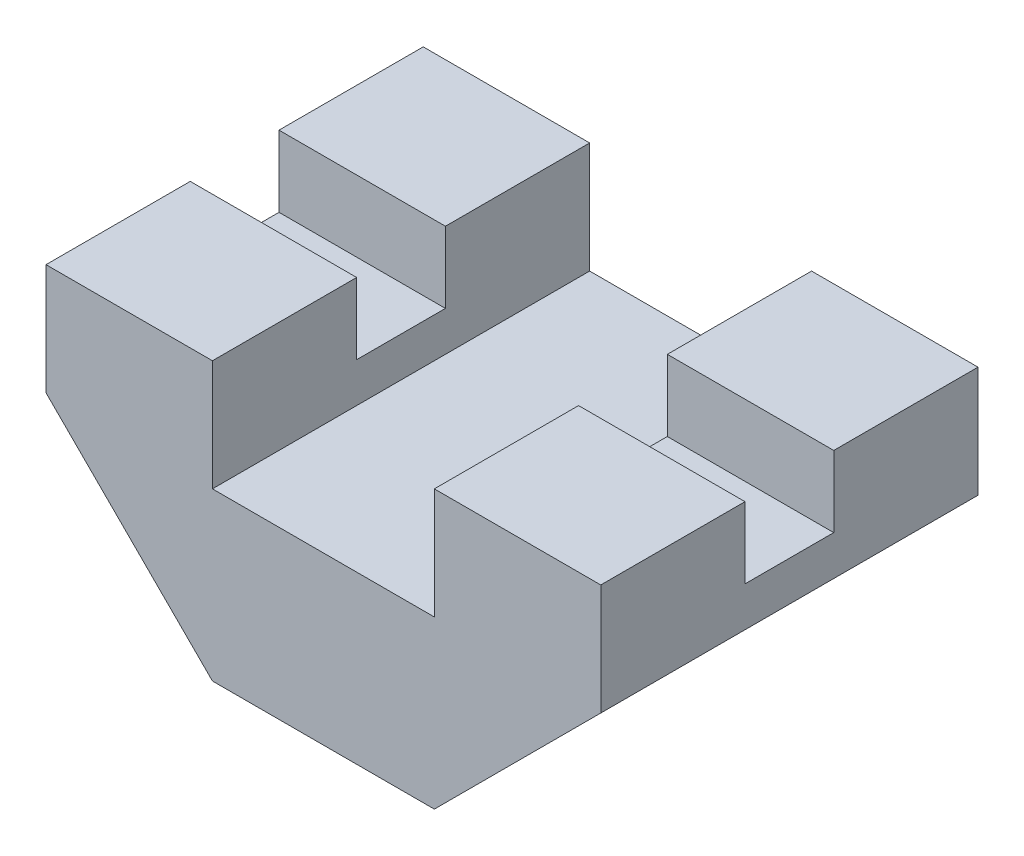
ISO-10303-21;
HEADER;
FILE_DESCRIPTION(('STEP AP214'),'2;1');
FILE_NAME('part.step','',(''),(''),'','','');
FILE_SCHEMA(('AUTOMOTIVE_DESIGN { 1 0 10303 214 1 1 1 1 }'));
ENDSEC;
DATA;
#1=APPLICATION_CONTEXT('core data for automotive mechanical design processes');
#2=APPLICATION_PROTOCOL_DEFINITION('international standard','automotive_design',2000,#1);
#3=PRODUCT_CONTEXT('',#1,'mechanical');
#4=PRODUCT('Part','Part','',(#3));
#5=PRODUCT_RELATED_PRODUCT_CATEGORY('part','',(#4));
#6=PRODUCT_DEFINITION_FORMATION('','',#4);
#7=PRODUCT_DEFINITION_CONTEXT('part definition',#1,'design');
#8=PRODUCT_DEFINITION('design','',#6,#7);
#9=PRODUCT_DEFINITION_SHAPE('','',#8);
#10=(LENGTH_UNIT() NAMED_UNIT(*) SI_UNIT(.MILLI.,.METRE.));
#11=(NAMED_UNIT(*) PLANE_ANGLE_UNIT() SI_UNIT($,.RADIAN.));
#12=(NAMED_UNIT(*) SI_UNIT($,.STERADIAN.) SOLID_ANGLE_UNIT());
#13=UNCERTAINTY_MEASURE_WITH_UNIT(LENGTH_MEASURE(1.E-05),#10,'distance_accuracy_value','');
#14=(GEOMETRIC_REPRESENTATION_CONTEXT(3) GLOBAL_UNCERTAINTY_ASSIGNED_CONTEXT((#13)) GLOBAL_UNIT_ASSIGNED_CONTEXT((#10,
#11,#12)) REPRESENTATION_CONTEXT('',''));
#15=CARTESIAN_POINT('',(0.,0.,0.));
#16=DIRECTION('',(0.,0.,1.));
#17=DIRECTION('',(1.,0.,0.));
#18=AXIS2_PLACEMENT_3D('',#15,#16,#17);
#19=CARTESIAN_POINT('',(-448.962557603687,776.680107526882,1727.2));
#20=DIRECTION('',(0.,-1.,0.));
#21=DIRECTION('',(1.,0.,0.));
#22=AXIS2_PLACEMENT_3D('',#19,#20,#21);
#23=PLANE('',#22);
#24=DIRECTION('',(0.,0.,-1.));
#25=VECTOR('',#24,1.);
#26=CARTESIAN_POINT('',(313.037442396313,776.680107526882,1727.2));
#27=LINE('',#26,#25);
#28=CARTESIAN_POINT('',(313.037442396313,776.680107526882,1727.2));
#29=VERTEX_POINT('',#28);
#30=CARTESIAN_POINT('',(313.037442396313,776.680107526882,1066.8));
#31=VERTEX_POINT('',#30);
#32=EDGE_CURVE('E326',#29,#31,#27,.T.);
#33=ORIENTED_EDGE('',*,*,#32,.T.);
#34=DIRECTION('',(1.,0.,0.));
#35=VECTOR('',#34,1.);
#36=CARTESIAN_POINT('',(-2226.96255760369,776.680107526882,1066.8));
#37=LINE('',#36,#35);
#38=CARTESIAN_POINT('',(-448.962557603687,776.680107526882,1066.8));
#39=VERTEX_POINT('',#38);
#40=EDGE_CURVE('E215',#39,#31,#37,.T.);
#41=ORIENTED_EDGE('',*,*,#40,.F.);
#42=DIRECTION('',(0.,0.,-1.));
#43=VECTOR('',#42,1.);
#44=CARTESIAN_POINT('',(-448.962557603687,776.680107526882,1727.2));
#45=LINE('',#44,#43);
#46=CARTESIAN_POINT('',(-448.962557603687,776.680107526882,1727.2));
#47=VERTEX_POINT('',#46);
#48=EDGE_CURVE('E321',#47,#39,#45,.T.);
#49=ORIENTED_EDGE('',*,*,#48,.F.);
#50=DIRECTION('',(-1.,0.,0.));
#51=VECTOR('',#50,1.);
#52=CARTESIAN_POINT('',(-448.962557603687,776.680107526882,1727.2));
#53=LINE('',#52,#51);
#54=EDGE_CURVE('E256',#29,#47,#53,.T.);
#55=ORIENTED_EDGE('',*,*,#54,.F.);
#56=EDGE_LOOP('',(#33,#41,#49,#55));
#57=FACE_BOUND('',#56,.T.);
#58=ADVANCED_FACE('F45',(#57),#23,.F.);
#59=CARTESIAN_POINT('',(-2226.96255760369,776.680107526882,1727.2));
#60=DIRECTION('',(0.,-1.,0.));
#61=DIRECTION('',(0.,0.,-1.));
#62=AXIS2_PLACEMENT_3D('',#59,#60,#61);
#63=PLANE('',#62);
#64=DIRECTION('',(0.,0.,-1.));
#65=VECTOR('',#64,1.);
#66=CARTESIAN_POINT('',(-1464.96255760369,776.680107526882,1727.2));
#67=LINE('',#66,#65);
#68=CARTESIAN_POINT('',(-1464.96255760369,776.680107526882,1727.2));
#69=VERTEX_POINT('',#68);
#70=CARTESIAN_POINT('',(-1464.96255760369,776.680107526882,1066.8));
#71=VERTEX_POINT('',#70);
#72=EDGE_CURVE('E308',#69,#71,#67,.T.);
#73=ORIENTED_EDGE('',*,*,#72,.T.);
#74=CARTESIAN_POINT('',(-2226.96255760369,776.680107526882,1066.8));
#75=VERTEX_POINT('',#74);
#76=EDGE_CURVE('E212',#75,#71,#37,.T.);
#77=ORIENTED_EDGE('',*,*,#76,.F.);
#78=DIRECTION('',(0.,0.,-1.));
#79=VECTOR('',#78,1.);
#80=CARTESIAN_POINT('',(-2226.96255760369,776.680107526882,1727.2));
#81=LINE('',#80,#79);
#82=CARTESIAN_POINT('',(-2226.96255760369,776.680107526882,1727.2));
#83=VERTEX_POINT('',#82);
#84=EDGE_CURVE('E196',#83,#75,#81,.T.);
#85=ORIENTED_EDGE('',*,*,#84,.F.);
#86=DIRECTION('',(-1.,0.,0.));
#87=VECTOR('',#86,1.);
#88=CARTESIAN_POINT('',(-2226.96255760369,776.680107526882,1727.2));
#89=LINE('',#88,#87);
#90=EDGE_CURVE('E268',#69,#83,#89,.T.);
#91=ORIENTED_EDGE('',*,*,#90,.F.);
#92=EDGE_LOOP('',(#73,#77,#85,#91));
#93=FACE_BOUND('',#92,.T.);
#94=ADVANCED_FACE('F372',(#93),#63,.F.);
#95=CARTESIAN_POINT('',(-2226.96255760369,776.680107526882,1727.2));
#96=DIRECTION('',(1.,0.,0.));
#97=DIRECTION('',(0.,0.,-1.));
#98=AXIS2_PLACEMENT_3D('',#95,#96,#97);
#99=PLANE('',#98);
#100=ORIENTED_EDGE('',*,*,#84,.T.);
#101=DIRECTION('',(0.,-1.,0.));
#102=VECTOR('',#101,1.);
#103=CARTESIAN_POINT('',(-2226.96255760369,776.680107526882,1066.8));
#104=LINE('',#103,#102);
#105=CARTESIAN_POINT('',(-2226.96255760369,450.776221941659,1066.8));
#106=VERTEX_POINT('',#105);
#107=EDGE_CURVE('E175',#75,#106,#104,.T.);
#108=ORIENTED_EDGE('',*,*,#107,.T.);
#109=DIRECTION('',(0.,0.,-1.));
#110=VECTOR('',#109,1.);
#111=CARTESIAN_POINT('',(-2226.96255760369,450.776221941659,1066.8));
#112=LINE('',#111,#110);
#113=CARTESIAN_POINT('',(-2226.96255760369,450.776221941659,660.4));
#114=VERTEX_POINT('',#113);
#115=EDGE_CURVE('E184',#106,#114,#112,.T.);
#116=ORIENTED_EDGE('',*,*,#115,.T.);
#117=DIRECTION('',(0.,1.,0.));
#118=VECTOR('',#117,1.);
#119=CARTESIAN_POINT('',(-2226.96255760369,776.680107526882,660.4));
#120=LINE('',#119,#118);
#121=CARTESIAN_POINT('',(-2226.96255760369,776.680107526882,660.4));
#122=VERTEX_POINT('',#121);
#123=EDGE_CURVE('E191',#114,#122,#120,.T.);
#124=ORIENTED_EDGE('',*,*,#123,.T.);
#125=CARTESIAN_POINT('',(-2226.96255760369,776.680107526882,0.));
#126=VERTEX_POINT('',#125);
#127=EDGE_CURVE('E271',#122,#126,#81,.T.);
#128=ORIENTED_EDGE('',*,*,#127,.T.);
#129=DIRECTION('',(0.,-1.,0.));
#130=VECTOR('',#129,1.);
#131=CARTESIAN_POINT('',(-2226.96255760369,776.680107526882,0.));
#132=LINE('',#131,#130);
#133=CARTESIAN_POINT('',(-2226.96255760369,268.680107526882,0.));
#134=VERTEX_POINT('',#133);
#135=EDGE_CURVE('E238',#126,#134,#132,.T.);
#136=ORIENTED_EDGE('',*,*,#135,.T.);
#137=DIRECTION('',(0.,0.,-1.));
#138=VECTOR('',#137,1.);
#139=CARTESIAN_POINT('',(-2226.96255760369,268.680107526882,1727.2));
#140=LINE('',#139,#138);
#141=CARTESIAN_POINT('',(-2226.96255760369,268.680107526882,1727.2));
#142=VERTEX_POINT('',#141);
#143=EDGE_CURVE('E54',#142,#134,#140,.T.);
#144=ORIENTED_EDGE('',*,*,#143,.F.);
#145=DIRECTION('',(0.,-1.,0.));
#146=VECTOR('',#145,1.);
#147=CARTESIAN_POINT('',(-2226.96255760369,776.680107526882,1727.2));
#148=LINE('',#147,#146);
#149=EDGE_CURVE('E239',#83,#142,#148,.T.);
#150=ORIENTED_EDGE('',*,*,#149,.F.);
#151=EDGE_LOOP('',(#100,#108,#116,#124,#128,#136,#144,#150));
#152=FACE_BOUND('',#151,.T.);
#153=ADVANCED_FACE('F47',(#152),#99,.F.);
#154=CARTESIAN_POINT('',(-2226.96255760369,268.680107526882,1727.2));
#155=DIRECTION('',(0.707106781186549,0.707106781186546,0.));
#156=DIRECTION('',(-0.707106781186546,0.707106781186549,0.));
#157=AXIS2_PLACEMENT_3D('',#154,#155,#156);
#158=PLANE('',#157);
#159=DIRECTION('',(0.707106781186546,-0.707106781186549,0.));
#160=VECTOR('',#159,1.);
#161=CARTESIAN_POINT('',(-2226.96255760369,268.680107526882,0.));
#162=LINE('',#161,#160);
#163=CARTESIAN_POINT('',(-1464.96255760369,-493.319892473118,0.));
#164=VERTEX_POINT('',#163);
#165=EDGE_CURVE('E275',#134,#164,#162,.T.);
#166=ORIENTED_EDGE('',*,*,#165,.T.);
#167=DIRECTION('',(0.,0.,-1.));
#168=VECTOR('',#167,1.);
#169=CARTESIAN_POINT('',(-1464.96255760369,-493.319892473118,1727.2));
#170=LINE('',#169,#168);
#171=CARTESIAN_POINT('',(-1464.96255760369,-493.319892473118,1727.2));
#172=VERTEX_POINT('',#171);
#173=EDGE_CURVE('E338',#172,#164,#170,.T.);
#174=ORIENTED_EDGE('',*,*,#173,.F.);
#175=DIRECTION('',(0.707106781186546,-0.707106781186549,0.));
#176=VECTOR('',#175,1.);
#177=CARTESIAN_POINT('',(-2226.96255760369,268.680107526882,1727.2));
#178=LINE('',#177,#176);
#179=EDGE_CURVE('E243',#142,#172,#178,.T.);
#180=ORIENTED_EDGE('',*,*,#179,.F.);
#181=ORIENTED_EDGE('',*,*,#143,.T.);
#182=EDGE_LOOP('',(#166,#174,#180,#181));
#183=FACE_BOUND('',#182,.T.);
#184=ADVANCED_FACE('F345',(#183),#158,.F.);
#185=CARTESIAN_POINT('',(-1464.96255760369,-493.319892473118,1727.2));
#186=DIRECTION('',(0.,1.,0.));
#187=DIRECTION('',(-1.,0.,0.));
#188=AXIS2_PLACEMENT_3D('',#185,#186,#187);
#189=PLANE('',#188);
#190=DIRECTION('',(1.,0.,0.));
#191=VECTOR('',#190,1.);
#192=CARTESIAN_POINT('',(-1464.96255760369,-493.319892473118,0.));
#193=LINE('',#192,#191);
#194=CARTESIAN_POINT('',(-448.962557603687,-493.319892473118,0.));
#195=VERTEX_POINT('',#194);
#196=EDGE_CURVE('E278',#164,#195,#193,.T.);
#197=ORIENTED_EDGE('',*,*,#196,.T.);
#198=DIRECTION('',(0.,0.,-1.));
#199=VECTOR('',#198,1.);
#200=CARTESIAN_POINT('',(-448.962557603687,-493.319892473118,1727.2));
#201=LINE('',#200,#199);
#202=CARTESIAN_POINT('',(-448.962557603687,-493.319892473118,1727.2));
#203=VERTEX_POINT('',#202);
#204=EDGE_CURVE('E334',#203,#195,#201,.T.);
#205=ORIENTED_EDGE('',*,*,#204,.F.);
#206=DIRECTION('',(1.,0.,0.));
#207=VECTOR('',#206,1.);
#208=CARTESIAN_POINT('',(-1464.96255760369,-493.319892473118,1727.2));
#209=LINE('',#208,#207);
#210=EDGE_CURVE('E247',#172,#203,#209,.T.);
#211=ORIENTED_EDGE('',*,*,#210,.F.);
#212=ORIENTED_EDGE('',*,*,#173,.T.);
#213=EDGE_LOOP('',(#197,#205,#211,#212));
#214=FACE_BOUND('',#213,.T.);
#215=ADVANCED_FACE('F358',(#214),#189,.F.);
#216=CARTESIAN_POINT('',(-448.962557603687,-493.319892473118,1727.2));
#217=DIRECTION('',(-0.707106781186546,0.707106781186549,0.));
#218=DIRECTION('',(-0.707106781186549,-0.707106781186546,0.));
#219=AXIS2_PLACEMENT_3D('',#216,#217,#218);
#220=PLANE('',#219);
#221=DIRECTION('',(0.707106781186549,0.707106781186546,0.));
#222=VECTOR('',#221,1.);
#223=CARTESIAN_POINT('',(-448.962557603687,-493.319892473118,0.));
#224=LINE('',#223,#222);
#225=CARTESIAN_POINT('',(313.037442396313,268.680107526879,0.));
#226=VERTEX_POINT('',#225);
#227=EDGE_CURVE('E281',#195,#226,#224,.T.);
#228=ORIENTED_EDGE('',*,*,#227,.T.);
#229=DIRECTION('',(0.,0.,-1.));
#230=VECTOR('',#229,1.);
#231=CARTESIAN_POINT('',(313.037442396313,268.680107526879,1727.2));
#232=LINE('',#231,#230);
#233=CARTESIAN_POINT('',(313.037442396313,268.680107526879,1727.2));
#234=VERTEX_POINT('',#233);
#235=EDGE_CURVE('E330',#234,#226,#232,.T.);
#236=ORIENTED_EDGE('',*,*,#235,.F.);
#237=DIRECTION('',(0.707106781186549,0.707106781186546,0.));
#238=VECTOR('',#237,1.);
#239=CARTESIAN_POINT('',(-448.962557603687,-493.319892473118,1727.2));
#240=LINE('',#239,#238);
#241=EDGE_CURVE('E250',#203,#234,#240,.T.);
#242=ORIENTED_EDGE('',*,*,#241,.F.);
#243=ORIENTED_EDGE('',*,*,#204,.T.);
#244=EDGE_LOOP('',(#228,#236,#242,#243));
#245=FACE_BOUND('',#244,.T.);
#246=ADVANCED_FACE('F362',(#245),#220,.F.);
#247=CARTESIAN_POINT('',(313.037442396313,776.680107526882,1727.2));
#248=DIRECTION('',(-1.,0.,0.));
#249=DIRECTION('',(0.,-1.,0.));
#250=AXIS2_PLACEMENT_3D('',#247,#248,#249);
#251=PLANE('',#250);
#252=DIRECTION('',(0.,0.,-1.));
#253=VECTOR('',#252,1.);
#254=CARTESIAN_POINT('',(313.037442396313,450.776221941659,1066.8));
#255=LINE('',#254,#253);
#256=CARTESIAN_POINT('',(313.037442396313,450.776221941659,1066.8));
#257=VERTEX_POINT('',#256);
#258=CARTESIAN_POINT('',(313.037442396313,450.776221941659,660.4));
#259=VERTEX_POINT('',#258);
#260=EDGE_CURVE('E201',#257,#259,#255,.T.);
#261=ORIENTED_EDGE('',*,*,#260,.F.);
#262=DIRECTION('',(0.,-1.,0.));
#263=VECTOR('',#262,1.);
#264=CARTESIAN_POINT('',(313.037442396313,776.680107526882,1066.8));
#265=LINE('',#264,#263);
#266=EDGE_CURVE('E206',#31,#257,#265,.T.);
#267=ORIENTED_EDGE('',*,*,#266,.F.);
#268=ORIENTED_EDGE('',*,*,#32,.F.);
#269=DIRECTION('',(0.,1.,0.));
#270=VECTOR('',#269,1.);
#271=CARTESIAN_POINT('',(313.037442396313,776.680107526882,1727.2));
#272=LINE('',#271,#270);
#273=EDGE_CURVE('E253',#234,#29,#272,.T.);
#274=ORIENTED_EDGE('',*,*,#273,.F.);
#275=ORIENTED_EDGE('',*,*,#235,.T.);
#276=DIRECTION('',(0.,1.,0.));
#277=VECTOR('',#276,1.);
#278=CARTESIAN_POINT('',(313.037442396313,776.680107526882,0.));
#279=LINE('',#278,#277);
#280=CARTESIAN_POINT('',(313.037442396313,776.680107526882,0.));
#281=VERTEX_POINT('',#280);
#282=EDGE_CURVE('E284',#226,#281,#279,.T.);
#283=ORIENTED_EDGE('',*,*,#282,.T.);
#284=CARTESIAN_POINT('',(313.037442396313,776.680107526882,660.4));
#285=VERTEX_POINT('',#284);
#286=EDGE_CURVE('E325',#285,#281,#27,.T.);
#287=ORIENTED_EDGE('',*,*,#286,.F.);
#288=DIRECTION('',(0.,1.,0.));
#289=VECTOR('',#288,1.);
#290=CARTESIAN_POINT('',(313.037442396313,776.680107526882,660.4));
#291=LINE('',#290,#289);
#292=EDGE_CURVE('E198',#259,#285,#291,.T.);
#293=ORIENTED_EDGE('',*,*,#292,.F.);
#294=EDGE_LOOP('',(#261,#267,#268,#274,#275,#283,#287,#293));
#295=FACE_BOUND('',#294,.T.);
#296=ADVANCED_FACE('F395',(#295),#251,.F.);
#297=CARTESIAN_POINT('',(-448.962557603687,776.680107526882,660.4));
#298=VERTEX_POINT('',#297);
#299=CARTESIAN_POINT('',(-448.962557603687,776.680107526882,0.));
#300=VERTEX_POINT('',#299);
#301=EDGE_CURVE('E320',#298,#300,#45,.T.);
#302=ORIENTED_EDGE('',*,*,#301,.F.);
#303=DIRECTION('',(1.,0.,0.));
#304=VECTOR('',#303,1.);
#305=CARTESIAN_POINT('',(-2226.96255760369,776.680107526882,660.4));
#306=LINE('',#305,#304);
#307=EDGE_CURVE('E219',#298,#285,#306,.T.);
#308=ORIENTED_EDGE('',*,*,#307,.T.);
#309=ORIENTED_EDGE('',*,*,#286,.T.);
#310=DIRECTION('',(-1.,0.,0.));
#311=VECTOR('',#310,1.);
#312=CARTESIAN_POINT('',(-448.962557603687,776.680107526882,0.));
#313=LINE('',#312,#311);
#314=EDGE_CURVE('E288',#281,#300,#313,.T.);
#315=ORIENTED_EDGE('',*,*,#314,.T.);
#316=EDGE_LOOP('',(#302,#308,#309,#315));
#317=FACE_BOUND('',#316,.T.);
#318=ADVANCED_FACE('F401',(#317),#23,.F.);
#319=CARTESIAN_POINT('',(-448.962557603687,776.680107526882,1727.2));
#320=DIRECTION('',(1.,0.,0.));
#321=DIRECTION('',(0.,1.,0.));
#322=AXIS2_PLACEMENT_3D('',#319,#320,#321);
#323=PLANE('',#322);
#324=ORIENTED_EDGE('',*,*,#48,.T.);
#325=DIRECTION('',(0.,-1.,0.));
#326=VECTOR('',#325,1.);
#327=CARTESIAN_POINT('',(-448.962557603687,776.680107526882,1066.8));
#328=LINE('',#327,#326);
#329=CARTESIAN_POINT('',(-448.962557603687,450.776221941659,1066.8));
#330=VERTEX_POINT('',#329);
#331=EDGE_CURVE('E230',#39,#330,#328,.T.);
#332=ORIENTED_EDGE('',*,*,#331,.T.);
#333=DIRECTION('',(0.,0.,-1.));
#334=VECTOR('',#333,1.);
#335=CARTESIAN_POINT('',(-448.962557603687,450.776221941659,1727.2));
#336=LINE('',#335,#334);
#337=CARTESIAN_POINT('',(-448.962557603687,450.776221941659,660.4));
#338=VERTEX_POINT('',#337);
#339=EDGE_CURVE('E234',#330,#338,#336,.T.);
#340=ORIENTED_EDGE('',*,*,#339,.T.);
#341=DIRECTION('',(0.,1.,0.));
#342=VECTOR('',#341,1.);
#343=CARTESIAN_POINT('',(-448.962557603687,776.680107526882,660.4));
#344=LINE('',#343,#342);
#345=EDGE_CURVE('E224',#338,#298,#344,.T.);
#346=ORIENTED_EDGE('',*,*,#345,.T.);
#347=ORIENTED_EDGE('',*,*,#301,.T.);
#348=DIRECTION('',(0.,-1.,0.));
#349=VECTOR('',#348,1.);
#350=CARTESIAN_POINT('',(-448.962557603687,776.680107526882,0.));
#351=LINE('',#350,#349);
#352=CARTESIAN_POINT('',(-448.962557603687,268.680107526882,0.));
#353=VERTEX_POINT('',#352);
#354=EDGE_CURVE('E292',#300,#353,#351,.T.);
#355=ORIENTED_EDGE('',*,*,#354,.T.);
#356=DIRECTION('',(0.,0.,-1.));
#357=VECTOR('',#356,1.);
#358=CARTESIAN_POINT('',(-448.962557603687,268.680107526882,1727.2));
#359=LINE('',#358,#357);
#360=CARTESIAN_POINT('',(-448.962557603687,268.680107526882,1727.2));
#361=VERTEX_POINT('',#360);
#362=EDGE_CURVE('E316',#361,#353,#359,.T.);
#363=ORIENTED_EDGE('',*,*,#362,.F.);
#364=DIRECTION('',(0.,-1.,0.));
#365=VECTOR('',#364,1.);
#366=CARTESIAN_POINT('',(-448.962557603687,776.680107526882,1727.2));
#367=LINE('',#366,#365);
#368=EDGE_CURVE('E259',#47,#361,#367,.T.);
#369=ORIENTED_EDGE('',*,*,#368,.F.);
#370=EDGE_LOOP('',(#324,#332,#340,#346,#347,#355,#363,#369));
#371=FACE_BOUND('',#370,.T.);
#372=ADVANCED_FACE('F414',(#371),#323,.F.);
#373=CARTESIAN_POINT('',(-1464.96255760369,268.680107526882,1727.2));
#374=DIRECTION('',(0.,-1.,0.));
#375=DIRECTION('',(0.,0.,-1.));
#376=AXIS2_PLACEMENT_3D('',#373,#374,#375);
#377=PLANE('',#376);
#378=DIRECTION('',(-1.,0.,0.));
#379=VECTOR('',#378,1.);
#380=CARTESIAN_POINT('',(-1464.96255760369,268.680107526882,0.));
#381=LINE('',#380,#379);
#382=CARTESIAN_POINT('',(-1464.96255760369,268.680107526882,0.));
#383=VERTEX_POINT('',#382);
#384=EDGE_CURVE('E295',#353,#383,#381,.T.);
#385=ORIENTED_EDGE('',*,*,#384,.T.);
#386=DIRECTION('',(0.,0.,-1.));
#387=VECTOR('',#386,1.);
#388=CARTESIAN_POINT('',(-1464.96255760369,268.680107526882,1727.2));
#389=LINE('',#388,#387);
#390=CARTESIAN_POINT('',(-1464.96255760369,268.680107526882,1727.2));
#391=VERTEX_POINT('',#390);
#392=EDGE_CURVE('E312',#391,#383,#389,.T.);
#393=ORIENTED_EDGE('',*,*,#392,.F.);
#394=DIRECTION('',(-1.,0.,0.));
#395=VECTOR('',#394,1.);
#396=CARTESIAN_POINT('',(-1464.96255760369,268.680107526882,1727.2));
#397=LINE('',#396,#395);
#398=EDGE_CURVE('E262',#361,#391,#397,.T.);
#399=ORIENTED_EDGE('',*,*,#398,.F.);
#400=ORIENTED_EDGE('',*,*,#362,.T.);
#401=EDGE_LOOP('',(#385,#393,#399,#400));
#402=FACE_BOUND('',#401,.T.);
#403=ADVANCED_FACE('F410',(#402),#377,.F.);
#404=CARTESIAN_POINT('',(-1464.96255760369,776.680107526882,1727.2));
#405=DIRECTION('',(-1.,0.,0.));
#406=DIRECTION('',(0.,0.,1.));
#407=AXIS2_PLACEMENT_3D('',#404,#405,#406);
#408=PLANE('',#407);
#409=DIRECTION('',(0.,0.,1.));
#410=VECTOR('',#409,1.);
#411=CARTESIAN_POINT('',(-1464.96255760369,450.776221941659,1727.2));
#412=LINE('',#411,#410);
#413=CARTESIAN_POINT('',(-1464.96255760369,450.776221941659,660.4));
#414=VERTEX_POINT('',#413);
#415=CARTESIAN_POINT('',(-1464.96255760369,450.776221941659,1066.8));
#416=VERTEX_POINT('',#415);
#417=EDGE_CURVE('E11',#414,#416,#412,.T.);
#418=ORIENTED_EDGE('',*,*,#417,.T.);
#419=DIRECTION('',(0.,1.,0.));
#420=VECTOR('',#419,1.);
#421=CARTESIAN_POINT('',(-1464.96255760369,776.680107526882,1066.8));
#422=LINE('',#421,#420);
#423=EDGE_CURVE('E178',#416,#71,#422,.T.);
#424=ORIENTED_EDGE('',*,*,#423,.T.);
#425=ORIENTED_EDGE('',*,*,#72,.F.);
#426=DIRECTION('',(0.,1.,0.));
#427=VECTOR('',#426,1.);
#428=CARTESIAN_POINT('',(-1464.96255760369,776.680107526882,1727.2));
#429=LINE('',#428,#427);
#430=EDGE_CURVE('E265',#391,#69,#429,.T.);
#431=ORIENTED_EDGE('',*,*,#430,.F.);
#432=ORIENTED_EDGE('',*,*,#392,.T.);
#433=DIRECTION('',(0.,1.,0.));
#434=VECTOR('',#433,1.);
#435=CARTESIAN_POINT('',(-1464.96255760369,776.680107526882,0.));
#436=LINE('',#435,#434);
#437=CARTESIAN_POINT('',(-1464.96255760369,776.680107526882,0.));
#438=VERTEX_POINT('',#437);
#439=EDGE_CURVE('E298',#383,#438,#436,.T.);
#440=ORIENTED_EDGE('',*,*,#439,.T.);
#441=CARTESIAN_POINT('',(-1464.96255760369,776.680107526882,660.4));
#442=VERTEX_POINT('',#441);
#443=EDGE_CURVE('E307',#442,#438,#67,.T.);
#444=ORIENTED_EDGE('',*,*,#443,.F.);
#445=DIRECTION('',(0.,-1.,0.));
#446=VECTOR('',#445,1.);
#447=CARTESIAN_POINT('',(-1464.96255760369,776.680107526882,660.4));
#448=LINE('',#447,#446);
#449=EDGE_CURVE('E69',#442,#414,#448,.T.);
#450=ORIENTED_EDGE('',*,*,#449,.T.);
#451=EDGE_LOOP('',(#418,#424,#425,#431,#432,#440,#444,#450));
#452=FACE_BOUND('',#451,.T.);
#453=ADVANCED_FACE('F374',(#452),#408,.F.);
#454=ORIENTED_EDGE('',*,*,#127,.F.);
#455=EDGE_CURVE('E216',#122,#442,#306,.T.);
#456=ORIENTED_EDGE('',*,*,#455,.T.);
#457=ORIENTED_EDGE('',*,*,#443,.T.);
#458=DIRECTION('',(-1.,0.,0.));
#459=VECTOR('',#458,1.);
#460=CARTESIAN_POINT('',(-2226.96255760369,776.680107526882,0.));
#461=LINE('',#460,#459);
#462=EDGE_CURVE('E244',#438,#126,#461,.T.);
#463=ORIENTED_EDGE('',*,*,#462,.T.);
#464=EDGE_LOOP('',(#454,#456,#457,#463));
#465=FACE_BOUND('',#464,.T.);
#466=ADVANCED_FACE('F378',(#465),#63,.F.);
#467=CARTESIAN_POINT('',(0.,0.,1727.2));
#468=DIRECTION('',(0.,0.,1.));
#469=DIRECTION('',(1.,0.,0.));
#470=AXIS2_PLACEMENT_3D('',#467,#468,#469);
#471=PLANE('',#470);
#472=ORIENTED_EDGE('',*,*,#149,.T.);
#473=ORIENTED_EDGE('',*,*,#179,.T.);
#474=ORIENTED_EDGE('',*,*,#210,.T.);
#475=ORIENTED_EDGE('',*,*,#241,.T.);
#476=ORIENTED_EDGE('',*,*,#273,.T.);
#477=ORIENTED_EDGE('',*,*,#54,.T.);
#478=ORIENTED_EDGE('',*,*,#368,.T.);
#479=ORIENTED_EDGE('',*,*,#398,.T.);
#480=ORIENTED_EDGE('',*,*,#430,.T.);
#481=ORIENTED_EDGE('',*,*,#90,.T.);
#482=EDGE_LOOP('',(#472,#473,#474,#475,#476,#477,#478,#479,#480,#481));
#483=FACE_BOUND('',#482,.T.);
#484=ADVANCED_FACE('F366',(#483),#471,.T.);
#485=CARTESIAN_POINT('',(0.,0.,0.));
#486=DIRECTION('',(0.,0.,1.));
#487=DIRECTION('',(1.,0.,0.));
#488=AXIS2_PLACEMENT_3D('',#485,#486,#487);
#489=PLANE('',#488);
#490=ORIENTED_EDGE('',*,*,#135,.F.);
#491=ORIENTED_EDGE('',*,*,#462,.F.);
#492=ORIENTED_EDGE('',*,*,#439,.F.);
#493=ORIENTED_EDGE('',*,*,#384,.F.);
#494=ORIENTED_EDGE('',*,*,#354,.F.);
#495=ORIENTED_EDGE('',*,*,#314,.F.);
#496=ORIENTED_EDGE('',*,*,#282,.F.);
#497=ORIENTED_EDGE('',*,*,#227,.F.);
#498=ORIENTED_EDGE('',*,*,#196,.F.);
#499=ORIENTED_EDGE('',*,*,#165,.F.);
#500=EDGE_LOOP('',(#490,#491,#492,#493,#494,#495,#496,#497,#498,#499));
#501=FACE_BOUND('',#500,.T.);
#502=ADVANCED_FACE('F351',(#501),#489,.F.);
#503=CARTESIAN_POINT('',(-2226.96255760369,776.680107526882,1066.8));
#504=DIRECTION('',(0.,0.,1.));
#505=DIRECTION('',(1.,0.,0.));
#506=AXIS2_PLACEMENT_3D('',#503,#504,#505);
#507=PLANE('',#506);
#508=DIRECTION('',(1.,0.,0.));
#509=VECTOR('',#508,1.);
#510=CARTESIAN_POINT('',(-2226.96255760369,450.776221941659,1066.8));
#511=LINE('',#510,#509);
#512=EDGE_CURVE('E171',#106,#416,#511,.T.);
#513=ORIENTED_EDGE('',*,*,#512,.F.);
#514=ORIENTED_EDGE('',*,*,#107,.F.);
#515=ORIENTED_EDGE('',*,*,#76,.T.);
#516=ORIENTED_EDGE('',*,*,#423,.F.);
#517=EDGE_LOOP('',(#513,#514,#515,#516));
#518=FACE_BOUND('',#517,.T.);
#519=ADVANCED_FACE('F173',(#518),#507,.F.);
#520=CARTESIAN_POINT('',(-2226.96255760369,776.680107526882,660.4));
#521=DIRECTION('',(0.,0.,-1.));
#522=DIRECTION('',(-1.,0.,0.));
#523=AXIS2_PLACEMENT_3D('',#520,#521,#522);
#524=PLANE('',#523);
#525=ORIENTED_EDGE('',*,*,#455,.F.);
#526=ORIENTED_EDGE('',*,*,#123,.F.);
#527=DIRECTION('',(1.,0.,0.));
#528=VECTOR('',#527,1.);
#529=CARTESIAN_POINT('',(-2226.96255760369,450.776221941659,660.4));
#530=LINE('',#529,#528);
#531=EDGE_CURVE('E186',#114,#414,#530,.T.);
#532=ORIENTED_EDGE('',*,*,#531,.T.);
#533=ORIENTED_EDGE('',*,*,#449,.F.);
#534=EDGE_LOOP('',(#525,#526,#532,#533));
#535=FACE_BOUND('',#534,.T.);
#536=ADVANCED_FACE('F376',(#535),#524,.F.);
#537=CARTESIAN_POINT('',(-2226.96255760369,450.776221941659,1066.8));
#538=DIRECTION('',(0.,-1.,0.));
#539=DIRECTION('',(0.,0.,-1.));
#540=AXIS2_PLACEMENT_3D('',#537,#538,#539);
#541=PLANE('',#540);
#542=ORIENTED_EDGE('',*,*,#531,.F.);
#543=ORIENTED_EDGE('',*,*,#115,.F.);
#544=ORIENTED_EDGE('',*,*,#512,.T.);
#545=ORIENTED_EDGE('',*,*,#417,.F.);
#546=EDGE_LOOP('',(#542,#543,#544,#545));
#547=FACE_BOUND('',#546,.T.);
#548=ADVANCED_FACE('F185',(#547),#541,.F.);
#549=EDGE_CURVE('E181',#330,#257,#511,.T.);
#550=ORIENTED_EDGE('',*,*,#549,.T.);
#551=ORIENTED_EDGE('',*,*,#260,.T.);
#552=EDGE_CURVE('E61',#338,#259,#530,.T.);
#553=ORIENTED_EDGE('',*,*,#552,.F.);
#554=ORIENTED_EDGE('',*,*,#339,.F.);
#555=EDGE_LOOP('',(#550,#551,#553,#554));
#556=FACE_BOUND('',#555,.T.);
#557=ADVANCED_FACE('F387',(#556),#541,.F.);
#558=ORIENTED_EDGE('',*,*,#40,.T.);
#559=ORIENTED_EDGE('',*,*,#266,.T.);
#560=ORIENTED_EDGE('',*,*,#549,.F.);
#561=ORIENTED_EDGE('',*,*,#331,.F.);
#562=EDGE_LOOP('',(#558,#559,#560,#561));
#563=FACE_BOUND('',#562,.T.);
#564=ADVANCED_FACE('F392',(#563),#507,.F.);
#565=ORIENTED_EDGE('',*,*,#552,.T.);
#566=ORIENTED_EDGE('',*,*,#292,.T.);
#567=ORIENTED_EDGE('',*,*,#307,.F.);
#568=ORIENTED_EDGE('',*,*,#345,.F.);
#569=EDGE_LOOP('',(#565,#566,#567,#568));
#570=FACE_BOUND('',#569,.T.);
#571=ADVANCED_FACE('F398',(#570),#524,.F.);
#572=CLOSED_SHELL('',(#58,#94,#153,#184,#215,#246,#296,#318,#372,#403,#453,#466,#484,#502,#519,
#536,#548,#557,#564,#571));
#573=MANIFOLD_SOLID_BREP('B2',#572);
#574=ADVANCED_BREP_SHAPE_REPRESENTATION('',(#18,#573),#14);
#575=SHAPE_DEFINITION_REPRESENTATION(#9,#574);
ENDSEC;
END-ISO-10303-21;
